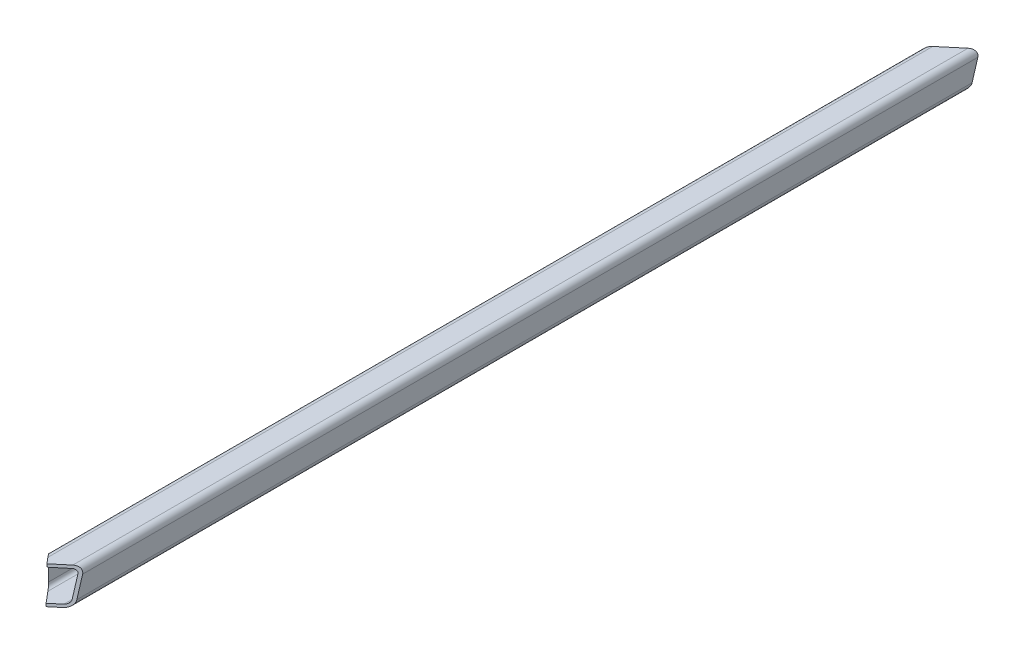
ISO-10303-21;
HEADER;
FILE_DESCRIPTION(('STEP AP214'),'2;1');
FILE_NAME('part.step','',(''),(''),'','','');
FILE_SCHEMA(('AUTOMOTIVE_DESIGN { 1 0 10303 214 1 1 1 1 }'));
ENDSEC;
DATA;
#1=APPLICATION_CONTEXT('core data for automotive mechanical design processes');
#2=APPLICATION_PROTOCOL_DEFINITION('international standard','automotive_design',2000,#1);
#3=PRODUCT_CONTEXT('',#1,'mechanical');
#4=PRODUCT('Part','Part','',(#3));
#5=PRODUCT_RELATED_PRODUCT_CATEGORY('part','',(#4));
#6=PRODUCT_DEFINITION_FORMATION('','',#4);
#7=PRODUCT_DEFINITION_CONTEXT('part definition',#1,'design');
#8=PRODUCT_DEFINITION('design','',#6,#7);
#9=PRODUCT_DEFINITION_SHAPE('','',#8);
#10=(LENGTH_UNIT() NAMED_UNIT(*) SI_UNIT(.MILLI.,.METRE.));
#11=(NAMED_UNIT(*) PLANE_ANGLE_UNIT() SI_UNIT($,.RADIAN.));
#12=(NAMED_UNIT(*) SI_UNIT($,.STERADIAN.) SOLID_ANGLE_UNIT());
#13=UNCERTAINTY_MEASURE_WITH_UNIT(LENGTH_MEASURE(1.E-05),#10,'distance_accuracy_value','');
#14=(GEOMETRIC_REPRESENTATION_CONTEXT(3) GLOBAL_UNCERTAINTY_ASSIGNED_CONTEXT((#13)) GLOBAL_UNIT_ASSIGNED_CONTEXT((#10,
#11,#12)) REPRESENTATION_CONTEXT('',''));
#15=CARTESIAN_POINT('',(0.,0.,0.));
#16=DIRECTION('',(0.,0.,1.));
#17=DIRECTION('',(1.,0.,0.));
#18=AXIS2_PLACEMENT_3D('',#15,#16,#17);
#19=CARTESIAN_POINT('',(-50.,-30.,0.));
#20=DIRECTION('',(-1.,0.,0.));
#21=DIRECTION('',(0.,1.,0.));
#22=AXIS2_PLACEMENT_3D('',#19,#20,#21);
#23=PLANE('',#22);
#24=DIRECTION('',(0.,-0.957462646749428,0.288557238827203));
#25=VECTOR('',#24,1.);
#26=CARTESIAN_POINT('',(-50.,7.09412884569476,73.3105957355298));
#27=LINE('',#26,#25);
#28=CARTESIAN_POINT('',(-50.,30.,66.4072925563847));
#29=VERTEX_POINT('',#28);
#30=CARTESIAN_POINT('',(-50.,-30.,84.4899137306008));
#31=VERTEX_POINT('',#30);
#32=EDGE_CURVE('E220',#29,#31,#27,.T.);
#33=ORIENTED_EDGE('',*,*,#32,.T.);
#34=DIRECTION('',(0.,0.,-1.));
#35=VECTOR('',#34,1.);
#36=CARTESIAN_POINT('',(-50.,-30.,0.));
#37=LINE('',#36,#35);
#38=CARTESIAN_POINT('',(-50.,-30.,2787.37015506374));
#39=VERTEX_POINT('',#38);
#40=EDGE_CURVE('E11',#39,#31,#37,.T.);
#41=ORIENTED_EDGE('',*,*,#40,.F.);
#42=DIRECTION('',(0.,1.,0.));
#43=VECTOR('',#42,1.);
#44=CARTESIAN_POINT('',(-50.,-14.9999999999995,2787.37015506374));
#45=LINE('',#44,#43);
#46=CARTESIAN_POINT('',(-50.,30.,2787.37015506374));
#47=VERTEX_POINT('',#46);
#48=EDGE_CURVE('E194',#39,#47,#45,.T.);
#49=ORIENTED_EDGE('',*,*,#48,.T.);
#50=DIRECTION('',(0.,0.,-1.));
#51=VECTOR('',#50,1.);
#52=CARTESIAN_POINT('',(-50.,30.,0.));
#53=LINE('',#52,#51);
#54=EDGE_CURVE('E103',#47,#29,#53,.T.);
#55=ORIENTED_EDGE('',*,*,#54,.T.);
#56=EDGE_LOOP('',(#33,#41,#49,#55));
#57=FACE_BOUND('',#56,.T.);
#58=ADVANCED_FACE('F17',(#57),#23,.T.);
#59=CARTESIAN_POINT('',(-30.,-30.,0.));
#60=DIRECTION('',(0.,0.,1.));
#61=DIRECTION('',(1.,0.,0.));
#62=AXIS2_PLACEMENT_3D('',#59,#60,#61);
#63=CYLINDRICAL_SURFACE('',#62,20.);
#64=CARTESIAN_POINT('',(-30.,-30.,67.7079211070552));
#65=DIRECTION('',(0.62631300489342,0.224951054343865,0.746410773670208));
#66=DIRECTION('',(0.702474766541767,0.252305856894065,-0.665485504687398));
#67=AXIS2_PLACEMENT_3D('',#64,#65,#66);
#68=ELLIPSE('',#67,26.7948972677031,20.);
#69=CARTESIAN_POINT('',(-30.,-50.,73.7354614984606));
#70=VERTEX_POINT('',#69);
#71=EDGE_CURVE('E264',#31,#70,#68,.T.);
#72=ORIENTED_EDGE('',*,*,#71,.T.);
#73=DIRECTION('',(0.,0.,1.));
#74=VECTOR('',#73,1.);
#75=CARTESIAN_POINT('',(-30.,-50.,0.));
#76=LINE('',#75,#74);
#77=CARTESIAN_POINT('',(-30.,-50.,2811.20522691563));
#78=VERTEX_POINT('',#77);
#79=EDGE_CURVE('E28',#70,#78,#76,.T.);
#80=ORIENTED_EDGE('',*,*,#79,.T.);
#81=CARTESIAN_POINT('',(-30.,-30.,2811.20522691563));
#82=DIRECTION('',(0.766044443118977,0.,-0.64278760968654));
#83=DIRECTION('',(0.64278760968654,0.,0.766044443118977));
#84=AXIS2_PLACEMENT_3D('',#81,#82,#83);
#85=ELLIPSE('',#84,31.1144765372082,20.);
#86=EDGE_CURVE('E190',#78,#39,#85,.T.);
#87=ORIENTED_EDGE('',*,*,#86,.T.);
#88=ORIENTED_EDGE('',*,*,#40,.T.);
#89=EDGE_LOOP('',(#72,#80,#87,#88));
#90=FACE_BOUND('',#89,.T.);
#91=ADVANCED_FACE('F561',(#90),#63,.T.);
#92=CARTESIAN_POINT('',(30.,-50.,0.));
#93=DIRECTION('',(0.,-1.,0.));
#94=DIRECTION('',(0.,0.,-1.));
#95=AXIS2_PLACEMENT_3D('',#92,#93,#94);
#96=PLANE('',#95);
#97=DIRECTION('',(0.766044443118978,0.,-0.642787609686539));
#98=VECTOR('',#97,1.);
#99=CARTESIAN_POINT('',(32.7147110753145,-50.,21.1115705657745));
#100=LINE('',#99,#98);
#101=CARTESIAN_POINT('',(30.,-50.,23.3894836278238));
#102=VERTEX_POINT('',#101);
#103=EDGE_CURVE('E311',#70,#102,#100,.T.);
#104=ORIENTED_EDGE('',*,*,#103,.T.);
#105=DIRECTION('',(0.,0.,-1.));
#106=VECTOR('',#105,1.);
#107=CARTESIAN_POINT('',(30.,-50.,0.));
#108=LINE('',#107,#106);
#109=CARTESIAN_POINT('',(30.,-50.,2823.4562481028));
#110=VERTEX_POINT('',#109);
#111=EDGE_CURVE('E205',#110,#102,#108,.T.);
#112=ORIENTED_EDGE('',*,*,#111,.F.);
#113=DIRECTION('',(-0.766044443118978,0.,0.642787609686539));
#114=VECTOR('',#113,1.);
#115=CARTESIAN_POINT('',(1411.47844037869,-50.,1664.25819830167));
#116=LINE('',#115,#114);
#117=CARTESIAN_POINT('',(0.823004993712573,-50.,2847.93865385143));
#118=VERTEX_POINT('',#117);
#119=EDGE_CURVE('E230',#110,#118,#116,.T.);
#120=ORIENTED_EDGE('',*,*,#119,.T.);
#121=DIRECTION('',(-0.64278760968654,0.,-0.766044443118977));
#122=VECTOR('',#121,1.);
#123=CARTESIAN_POINT('',(-1395.65543538498,-50.,1183.68045554977));
#124=LINE('',#123,#122);
#125=EDGE_CURVE('E193',#118,#78,#124,.T.);
#126=ORIENTED_EDGE('',*,*,#125,.T.);
#127=ORIENTED_EDGE('',*,*,#79,.F.);
#128=EDGE_LOOP('',(#104,#112,#120,#126,#127));
#129=FACE_BOUND('',#128,.T.);
#130=ADVANCED_FACE('F434',(#129),#96,.T.);
#131=CARTESIAN_POINT('',(-30.,30.,0.));
#132=DIRECTION('',(0.,0.,1.));
#133=DIRECTION('',(0.,-1.,0.));
#134=AXIS2_PLACEMENT_3D('',#131,#132,#133);
#135=CYLINDRICAL_SURFACE('',#134,20.);
#136=CARTESIAN_POINT('',(-30.,30.,49.6252999328391));
#137=DIRECTION('',(0.62631300489342,0.224951054343865,0.746410773670208));
#138=DIRECTION('',(-0.702474766541767,-0.252305856894065,0.665485504687398));
#139=AXIS2_PLACEMENT_3D('',#136,#137,#138);
#140=ELLIPSE('',#139,26.7948972677031,20.);
#141=CARTESIAN_POINT('',(-30.,50.,43.5977595414338));
#142=VERTEX_POINT('',#141);
#143=EDGE_CURVE('E21',#142,#29,#140,.T.);
#144=ORIENTED_EDGE('',*,*,#143,.T.);
#145=ORIENTED_EDGE('',*,*,#54,.F.);
#146=CARTESIAN_POINT('',(-30.,30.,2811.20522691563));
#147=DIRECTION('',(0.766044443118977,0.,-0.64278760968654));
#148=DIRECTION('',(0.64278760968654,0.,0.766044443118977));
#149=AXIS2_PLACEMENT_3D('',#146,#147,#148);
#150=ELLIPSE('',#149,31.1144765372082,20.);
#151=CARTESIAN_POINT('',(-30.,50.,2811.20522691563));
#152=VERTEX_POINT('',#151);
#153=EDGE_CURVE('E273',#47,#152,#150,.T.);
#154=ORIENTED_EDGE('',*,*,#153,.T.);
#155=DIRECTION('',(0.,0.,-1.));
#156=VECTOR('',#155,1.);
#157=CARTESIAN_POINT('',(-30.,50.,0.));
#158=LINE('',#157,#156);
#159=EDGE_CURVE('E195',#152,#142,#158,.T.);
#160=ORIENTED_EDGE('',*,*,#159,.T.);
#161=EDGE_LOOP('',(#144,#145,#154,#160));
#162=FACE_BOUND('',#161,.T.);
#163=ADVANCED_FACE('F500',(#162),#135,.T.);
#164=CARTESIAN_POINT('',(-30.,-30.,0.));
#165=DIRECTION('',(0.,0.,1.));
#166=DIRECTION('',(1.,0.,0.));
#167=AXIS2_PLACEMENT_3D('',#164,#165,#166);
#168=CYLINDRICAL_SURFACE('',#167,12.);
#169=CARTESIAN_POINT('',(-30.,-30.,67.7079211070552));
#170=DIRECTION('',(-0.62631300489342,-0.224951054343865,-0.746410773670208));
#171=DIRECTION('',(0.702474766541767,0.252305856894065,-0.665485504687398));
#172=AXIS2_PLACEMENT_3D('',#169,#170,#171);
#173=ELLIPSE('',#172,16.0769383606218,12.);
#174=CARTESIAN_POINT('',(-30.,-42.,71.3244453418984));
#175=VERTEX_POINT('',#174);
#176=CARTESIAN_POINT('',(-42.,-30.,77.7771166811826));
#177=VERTEX_POINT('',#176);
#178=EDGE_CURVE('E184',#175,#177,#173,.T.);
#179=ORIENTED_EDGE('',*,*,#178,.T.);
#180=DIRECTION('',(0.,0.,-1.));
#181=VECTOR('',#180,1.);
#182=CARTESIAN_POINT('',(-42.,-30.,0.));
#183=LINE('',#182,#181);
#184=CARTESIAN_POINT('',(-42.,-30.,2796.9041838045));
#185=VERTEX_POINT('',#184);
#186=EDGE_CURVE('E211',#185,#177,#183,.T.);
#187=ORIENTED_EDGE('',*,*,#186,.F.);
#188=CARTESIAN_POINT('',(-30.,-30.,2811.20522691563));
#189=DIRECTION('',(-0.766044443118977,0.,0.64278760968654));
#190=DIRECTION('',(0.64278760968654,0.,0.766044443118977));
#191=AXIS2_PLACEMENT_3D('',#188,#189,#190);
#192=ELLIPSE('',#191,18.6686859223249,12.);
#193=CARTESIAN_POINT('',(-30.,-42.,2811.20522691563));
#194=VERTEX_POINT('',#193);
#195=EDGE_CURVE('E265',#185,#194,#192,.T.);
#196=ORIENTED_EDGE('',*,*,#195,.T.);
#197=DIRECTION('',(0.,0.,-1.));
#198=VECTOR('',#197,1.);
#199=CARTESIAN_POINT('',(-30.,-42.,0.));
#200=LINE('',#199,#198);
#201=EDGE_CURVE('E280',#194,#175,#200,.T.);
#202=ORIENTED_EDGE('',*,*,#201,.T.);
#203=EDGE_LOOP('',(#179,#187,#196,#202));
#204=FACE_BOUND('',#203,.T.);
#205=ADVANCED_FACE('F359',(#204),#168,.F.);
#206=CARTESIAN_POINT('',(-42.,-30.,0.));
#207=DIRECTION('',(-1.,0.,0.));
#208=DIRECTION('',(0.,1.,0.));
#209=AXIS2_PLACEMENT_3D('',#206,#207,#208);
#210=PLANE('',#209);
#211=DIRECTION('',(0.,0.957462646749428,-0.288557238827203));
#212=VECTOR('',#211,1.);
#213=CARTESIAN_POINT('',(-42.,5.23949863124053,67.1567416125488));
#214=LINE('',#213,#212);
#215=CARTESIAN_POINT('',(-42.,30.,59.6944955069665));
#216=VERTEX_POINT('',#215);
#217=EDGE_CURVE('E209',#177,#216,#214,.T.);
#218=ORIENTED_EDGE('',*,*,#217,.T.);
#219=DIRECTION('',(0.,0.,1.));
#220=VECTOR('',#219,1.);
#221=CARTESIAN_POINT('',(-42.,30.,0.));
#222=LINE('',#221,#220);
#223=CARTESIAN_POINT('',(-42.,30.,2796.9041838045));
#224=VERTEX_POINT('',#223);
#225=EDGE_CURVE('E116',#216,#224,#222,.T.);
#226=ORIENTED_EDGE('',*,*,#225,.T.);
#227=DIRECTION('',(0.,-1.,0.));
#228=VECTOR('',#227,1.);
#229=CARTESIAN_POINT('',(-42.,-14.9999999999995,2796.9041838045));
#230=LINE('',#229,#228);
#231=EDGE_CURVE('E269',#224,#185,#230,.T.);
#232=ORIENTED_EDGE('',*,*,#231,.T.);
#233=ORIENTED_EDGE('',*,*,#186,.T.);
#234=EDGE_LOOP('',(#218,#226,#232,#233));
#235=FACE_BOUND('',#234,.T.);
#236=ADVANCED_FACE('F499',(#235),#210,.F.);
#237=CARTESIAN_POINT('',(-30.,30.,0.));
#238=DIRECTION('',(0.,0.,1.));
#239=DIRECTION('',(0.,-1.,0.));
#240=AXIS2_PLACEMENT_3D('',#237,#238,#239);
#241=CYLINDRICAL_SURFACE('',#240,12.);
#242=CARTESIAN_POINT('',(-30.,30.,49.6252999328391));
#243=DIRECTION('',(-0.62631300489342,-0.224951054343865,-0.746410773670208));
#244=DIRECTION('',(-0.702474766541767,-0.252305856894065,0.665485504687398));
#245=AXIS2_PLACEMENT_3D('',#242,#243,#244);
#246=ELLIPSE('',#245,16.0769383606218,12.);
#247=CARTESIAN_POINT('',(-30.,42.,46.0087756979959));
#248=VERTEX_POINT('',#247);
#249=EDGE_CURVE('E250',#216,#248,#246,.T.);
#250=ORIENTED_EDGE('',*,*,#249,.T.);
#251=DIRECTION('',(0.,0.,-1.));
#252=VECTOR('',#251,1.);
#253=CARTESIAN_POINT('',(-30.,42.,0.));
#254=LINE('',#253,#252);
#255=CARTESIAN_POINT('',(-30.,42.,2811.20522691563));
#256=VERTEX_POINT('',#255);
#257=EDGE_CURVE('E173',#256,#248,#254,.T.);
#258=ORIENTED_EDGE('',*,*,#257,.F.);
#259=CARTESIAN_POINT('',(-30.,30.,2811.20522691563));
#260=DIRECTION('',(-0.766044443118977,0.,0.64278760968654));
#261=DIRECTION('',(0.64278760968654,0.,0.766044443118977));
#262=AXIS2_PLACEMENT_3D('',#259,#260,#261);
#263=ELLIPSE('',#262,18.6686859223249,12.);
#264=EDGE_CURVE('E168',#256,#224,#263,.T.);
#265=ORIENTED_EDGE('',*,*,#264,.T.);
#266=ORIENTED_EDGE('',*,*,#225,.F.);
#267=EDGE_LOOP('',(#250,#258,#265,#266));
#268=FACE_BOUND('',#267,.T.);
#269=ADVANCED_FACE('F522',(#268),#241,.F.);
#270=CARTESIAN_POINT('',(-1401.85307405248,0.,1176.29439740218));
#271=DIRECTION('',(0.766044443118977,0.,-0.64278760968654));
#272=DIRECTION('',(0.,-1.,0.));
#273=AXIS2_PLACEMENT_3D('',#270,#271,#272);
#274=PLANE('',#273);
#275=DIRECTION('',(-0.14459575051816,0.974370064785235,-0.172322505153873));
#276=VECTOR('',#275,1.);
#277=CARTESIAN_POINT('',(-77.2010687028977,475.771479937275,2754.95318371466));
#278=LINE('',#277,#276);
#279=CARTESIAN_POINT('',(-0.364188708097686,-42.,2846.5238114922));
#280=VERTEX_POINT('',#279);
#281=EDGE_CURVE('E227',#118,#280,#278,.T.);
#282=ORIENTED_EDGE('',*,*,#281,.T.);
#283=DIRECTION('',(0.64278760968654,0.,0.766044443118977));
#284=VECTOR('',#283,1.);
#285=CARTESIAN_POINT('',(-1395.65543538498,-42.,1183.68045554977));
#286=LINE('',#285,#284);
#287=EDGE_CURVE('E270',#194,#280,#286,.T.);
#288=ORIENTED_EDGE('',*,*,#287,.F.);
#289=ORIENTED_EDGE('',*,*,#195,.F.);
#290=ORIENTED_EDGE('',*,*,#231,.F.);
#291=ORIENTED_EDGE('',*,*,#264,.F.);
#292=DIRECTION('',(-0.64278760968654,0.,-0.766044443118977));
#293=VECTOR('',#292,1.);
#294=CARTESIAN_POINT('',(-1408.05071271998,42.,1168.90833925458));
#295=LINE('',#294,#293);
#296=CARTESIAN_POINT('',(-12.829722577103,42.,2831.6679667202));
#297=VERTEX_POINT('',#296);
#298=EDGE_CURVE('E164',#297,#256,#295,.T.);
#299=ORIENTED_EDGE('',*,*,#298,.F.);
#300=DIRECTION('',(-0.14459575051816,0.974370064785235,-0.172322505153873));
#301=VECTOR('',#300,1.);
#302=CARTESIAN_POINT('',(-77.2010687028977,475.771479937275,2754.95318371466));
#303=LINE('',#302,#301);
#304=CARTESIAN_POINT('',(-14.016916278913,50.,2830.25312436097));
#305=VERTEX_POINT('',#304);
#306=EDGE_CURVE('E147',#297,#305,#303,.T.);
#307=ORIENTED_EDGE('',*,*,#306,.T.);
#308=DIRECTION('',(0.64278760968654,0.,0.766044443118977));
#309=VECTOR('',#308,1.);
#310=CARTESIAN_POINT('',(-1408.05071271998,50.,1168.90833925458));
#311=LINE('',#310,#309);
#312=EDGE_CURVE('E199',#152,#305,#311,.T.);
#313=ORIENTED_EDGE('',*,*,#312,.F.);
#314=ORIENTED_EDGE('',*,*,#153,.F.);
#315=ORIENTED_EDGE('',*,*,#48,.F.);
#316=ORIENTED_EDGE('',*,*,#86,.F.);
#317=ORIENTED_EDGE('',*,*,#125,.F.);
#318=EDGE_LOOP('',(#282,#288,#289,#290,#291,#299,#307,#313,#314,#315,#316,#317));
#319=FACE_BOUND('',#318,.T.);
#320=ADVANCED_FACE('F166',(#319),#274,.F.);
#321=CARTESIAN_POINT('',(30.,-42.,0.));
#322=DIRECTION('',(0.,-1.,0.));
#323=DIRECTION('',(0.,0.,-1.));
#324=AXIS2_PLACEMENT_3D('',#321,#322,#323);
#325=PLANE('',#324);
#326=DIRECTION('',(-0.766044443118978,0.,0.642787609686539));
#327=VECTOR('',#326,1.);
#328=CARTESIAN_POINT('',(31.5275173735045,-42.,19.6967282065372));
#329=LINE('',#328,#327);
#330=CARTESIAN_POINT('',(30.,-42.,20.9784674712617));
#331=VERTEX_POINT('',#330);
#332=EDGE_CURVE('E215',#331,#175,#329,.T.);
#333=ORIENTED_EDGE('',*,*,#332,.T.);
#334=ORIENTED_EDGE('',*,*,#201,.F.);
#335=ORIENTED_EDGE('',*,*,#287,.T.);
#336=DIRECTION('',(0.766044443118978,0.,-0.642787609686539));
#337=VECTOR('',#336,1.);
#338=CARTESIAN_POINT('',(1410.29124667688,-42.,1662.84335594243));
#339=LINE('',#338,#337);
#340=CARTESIAN_POINT('',(30.,-42.,2821.04523194623));
#341=VERTEX_POINT('',#340);
#342=EDGE_CURVE('E161',#280,#341,#339,.T.);
#343=ORIENTED_EDGE('',*,*,#342,.T.);
#344=DIRECTION('',(0.,0.,-1.));
#345=VECTOR('',#344,1.);
#346=CARTESIAN_POINT('',(30.,-42.,0.));
#347=LINE('',#346,#345);
#348=EDGE_CURVE('E247',#341,#331,#347,.T.);
#349=ORIENTED_EDGE('',*,*,#348,.T.);
#350=EDGE_LOOP('',(#333,#334,#335,#343,#349));
#351=FACE_BOUND('',#350,.T.);
#352=ADVANCED_FACE('F340',(#351),#325,.F.);
#353=CARTESIAN_POINT('',(1324.65200534958,475.771479937275,1578.65878631249));
#354=DIRECTION('',(-0.62631300489342,-0.224951054343865,-0.746410773670208));
#355=DIRECTION('',(-0.766044443118978,0.,0.64278760968654));
#356=AXIS2_PLACEMENT_3D('',#353,#354,#355);
#357=PLANE('',#356);
#358=ORIENTED_EDGE('',*,*,#306,.F.);
#359=DIRECTION('',(-0.766044443118978,0.,0.642787609686539));
#360=VECTOR('',#359,1.);
#361=CARTESIAN_POINT('',(1380.22099014288,42.,1662.75962746562));
#362=LINE('',#361,#360);
#363=CARTESIAN_POINT('',(30.,42.,2795.72956230233));
#364=VERTEX_POINT('',#363);
#365=EDGE_CURVE('E152',#364,#297,#362,.T.);
#366=ORIENTED_EDGE('',*,*,#365,.F.);
#367=CARTESIAN_POINT('',(30.,30.,2799.34608653717));
#368=DIRECTION('',(0.62631300489342,0.224951054343865,0.746410773670208));
#369=DIRECTION('',(-0.702474766541767,-0.252305856894065,0.665485504687398));
#370=AXIS2_PLACEMENT_3D('',#367,#368,#369);
#371=ELLIPSE('',#370,16.0769383606219,12.);
#372=CARTESIAN_POINT('',(42.,30.,2789.27689096305));
#373=VERTEX_POINT('',#372);
#374=EDGE_CURVE('E290',#373,#364,#371,.T.);
#375=ORIENTED_EDGE('',*,*,#374,.F.);
#376=DIRECTION('',(0.,0.957462646749428,-0.288557238827203));
#377=VECTOR('',#376,1.);
#378=CARTESIAN_POINT('',(42.,786.878146205039,2561.1712110819));
#379=LINE('',#378,#377);
#380=CARTESIAN_POINT('',(42.,-30.,2807.35951213726));
#381=VERTEX_POINT('',#380);
#382=EDGE_CURVE('E304',#381,#373,#379,.T.);
#383=ORIENTED_EDGE('',*,*,#382,.F.);
#384=CARTESIAN_POINT('',(30.,-30.,2817.42870771139));
#385=DIRECTION('',(0.62631300489342,0.224951054343865,0.746410773670208));
#386=DIRECTION('',(0.702474766541767,0.252305856894065,-0.665485504687399));
#387=AXIS2_PLACEMENT_3D('',#384,#385,#386);
#388=ELLIPSE('',#387,16.0769383606219,12.);
#389=EDGE_CURVE('E243',#341,#381,#388,.T.);
#390=ORIENTED_EDGE('',*,*,#389,.F.);
#391=ORIENTED_EDGE('',*,*,#342,.F.);
#392=ORIENTED_EDGE('',*,*,#281,.F.);
#393=ORIENTED_EDGE('',*,*,#119,.F.);
#394=CARTESIAN_POINT('',(30.,-30.,2817.42870771139));
#395=DIRECTION('',(-0.62631300489342,-0.224951054343865,-0.746410773670208));
#396=DIRECTION('',(0.702474766541767,0.252305856894065,-0.665485504687399));
#397=AXIS2_PLACEMENT_3D('',#394,#395,#396);
#398=ELLIPSE('',#397,26.7948972677031,20.);
#399=CARTESIAN_POINT('',(50.,-30.,2800.64671508784));
#400=VERTEX_POINT('',#399);
#401=EDGE_CURVE('E231',#400,#110,#398,.T.);
#402=ORIENTED_EDGE('',*,*,#401,.F.);
#403=DIRECTION('',(0.,-0.957462646749428,0.288557238827203));
#404=VECTOR('',#403,1.);
#405=CARTESIAN_POINT('',(50.,785.023515990584,2555.01735695892));
#406=LINE('',#405,#404);
#407=CARTESIAN_POINT('',(50.,30.,2782.56409391363));
#408=VERTEX_POINT('',#407);
#409=EDGE_CURVE('E204',#408,#400,#406,.T.);
#410=ORIENTED_EDGE('',*,*,#409,.F.);
#411=CARTESIAN_POINT('',(30.,30.,2799.34608653717));
#412=DIRECTION('',(-0.62631300489342,-0.224951054343865,-0.746410773670208));
#413=DIRECTION('',(-0.702474766541767,-0.252305856894065,0.665485504687399));
#414=AXIS2_PLACEMENT_3D('',#411,#412,#413);
#415=ELLIPSE('',#414,26.7948972677031,20.);
#416=CARTESIAN_POINT('',(30.,50.,2793.31854614577));
#417=VERTEX_POINT('',#416);
#418=EDGE_CURVE('E200',#417,#408,#415,.T.);
#419=ORIENTED_EDGE('',*,*,#418,.F.);
#420=DIRECTION('',(0.766044443118978,0.,-0.642787609686539));
#421=VECTOR('',#420,1.);
#422=CARTESIAN_POINT('',(1379.03379644107,50.,1661.34478510638));
#423=LINE('',#422,#421);
#424=EDGE_CURVE('E156',#305,#417,#423,.T.);
#425=ORIENTED_EDGE('',*,*,#424,.F.);
#426=EDGE_LOOP('',(#358,#366,#375,#383,#390,#391,#392,#393,#402,#410,#419,#425));
#427=FACE_BOUND('',#426,.T.);
#428=ADVANCED_FACE('F149',(#427),#357,.F.);
#429=CARTESIAN_POINT('',(-30.,50.,0.));
#430=DIRECTION('',(0.,1.,0.));
#431=DIRECTION('',(1.,0.,0.));
#432=AXIS2_PLACEMENT_3D('',#429,#430,#431);
#433=PLANE('',#432);
#434=DIRECTION('',(-0.766044443118978,0.,0.642787609686539));
#435=VECTOR('',#434,1.);
#436=CARTESIAN_POINT('',(0.270067137684953,50.,18.1981573704908));
#437=LINE('',#436,#435);
#438=CARTESIAN_POINT('',(30.,50.,-6.74821832920299));
#439=VERTEX_POINT('',#438);
#440=EDGE_CURVE('E251',#439,#142,#437,.T.);
#441=ORIENTED_EDGE('',*,*,#440,.T.);
#442=ORIENTED_EDGE('',*,*,#159,.F.);
#443=ORIENTED_EDGE('',*,*,#312,.T.);
#444=ORIENTED_EDGE('',*,*,#424,.T.);
#445=DIRECTION('',(0.,0.,-1.));
#446=VECTOR('',#445,1.);
#447=CARTESIAN_POINT('',(30.,50.,0.));
#448=LINE('',#447,#446);
#449=EDGE_CURVE('E236',#417,#439,#448,.T.);
#450=ORIENTED_EDGE('',*,*,#449,.T.);
#451=EDGE_LOOP('',(#441,#442,#443,#444,#450));
#452=FACE_BOUND('',#451,.T.);
#453=ADVANCED_FACE('F402',(#452),#433,.T.);
#454=CARTESIAN_POINT('',(30.,30.,0.));
#455=DIRECTION('',(0.,0.,1.));
#456=DIRECTION('',(-1.,0.,0.));
#457=AXIS2_PLACEMENT_3D('',#454,#455,#456);
#458=CYLINDRICAL_SURFACE('',#457,20.);
#459=CARTESIAN_POINT('',(30.,30.,-0.720677937797634));
#460=DIRECTION('',(0.62631300489342,0.224951054343865,0.746410773670208));
#461=DIRECTION('',(-0.702474766541767,-0.252305856894065,0.665485504687398));
#462=AXIS2_PLACEMENT_3D('',#459,#460,#461);
#463=ELLIPSE('',#462,26.7948972677031,20.);
#464=CARTESIAN_POINT('',(50.,30.,-17.5026705613432));
#465=VERTEX_POINT('',#464);
#466=EDGE_CURVE('E255',#465,#439,#463,.T.);
#467=ORIENTED_EDGE('',*,*,#466,.T.);
#468=ORIENTED_EDGE('',*,*,#449,.F.);
#469=ORIENTED_EDGE('',*,*,#418,.T.);
#470=DIRECTION('',(0.,0.,-1.));
#471=VECTOR('',#470,1.);
#472=CARTESIAN_POINT('',(50.,30.,0.));
#473=LINE('',#472,#471);
#474=EDGE_CURVE('E201',#408,#465,#473,.T.);
#475=ORIENTED_EDGE('',*,*,#474,.T.);
#476=EDGE_LOOP('',(#467,#468,#469,#475));
#477=FACE_BOUND('',#476,.T.);
#478=ADVANCED_FACE('F409',(#477),#458,.T.);
#479=CARTESIAN_POINT('',(50.,30.,0.));
#480=DIRECTION('',(1.,0.,0.));
#481=DIRECTION('',(0.,1.,0.));
#482=AXIS2_PLACEMENT_3D('',#479,#480,#481);
#483=PLANE('',#482);
#484=DIRECTION('',(0.,0.957462646749428,-0.288557238827203));
#485=VECTOR('',#484,1.);
#486=CARTESIAN_POINT('',(50.,11.4132927626295,-11.9010641305194));
#487=LINE('',#486,#485);
#488=CARTESIAN_POINT('',(50.,-30.,0.579950612872858));
#489=VERTEX_POINT('',#488);
#490=EDGE_CURVE('E256',#489,#465,#487,.T.);
#491=ORIENTED_EDGE('',*,*,#490,.T.);
#492=ORIENTED_EDGE('',*,*,#474,.F.);
#493=ORIENTED_EDGE('',*,*,#409,.T.);
#494=DIRECTION('',(0.,0.,-1.));
#495=VECTOR('',#494,1.);
#496=CARTESIAN_POINT('',(50.,-30.,0.));
#497=LINE('',#496,#495);
#498=EDGE_CURVE('E235',#400,#489,#497,.T.);
#499=ORIENTED_EDGE('',*,*,#498,.T.);
#500=EDGE_LOOP('',(#491,#492,#493,#499));
#501=FACE_BOUND('',#500,.T.);
#502=ADVANCED_FACE('F570',(#501),#483,.T.);
#503=CARTESIAN_POINT('',(30.,-30.,0.));
#504=DIRECTION('',(0.,0.,1.));
#505=DIRECTION('',(0.,1.,0.));
#506=AXIS2_PLACEMENT_3D('',#503,#504,#505);
#507=CYLINDRICAL_SURFACE('',#506,20.);
#508=CARTESIAN_POINT('',(30.,-30.,17.3619432364184));
#509=DIRECTION('',(0.62631300489342,0.224951054343865,0.746410773670208));
#510=DIRECTION('',(0.702474766541767,0.252305856894065,-0.665485504687398));
#511=AXIS2_PLACEMENT_3D('',#508,#509,#510);
#512=ELLIPSE('',#511,26.7948972677031,20.);
#513=EDGE_CURVE('E260',#102,#489,#512,.T.);
#514=ORIENTED_EDGE('',*,*,#513,.T.);
#515=ORIENTED_EDGE('',*,*,#498,.F.);
#516=ORIENTED_EDGE('',*,*,#401,.T.);
#517=ORIENTED_EDGE('',*,*,#111,.T.);
#518=EDGE_LOOP('',(#514,#515,#516,#517));
#519=FACE_BOUND('',#518,.T.);
#520=ADVANCED_FACE('F427',(#519),#507,.T.);
#521=CARTESIAN_POINT('',(30.,-30.,0.));
#522=DIRECTION('',(0.,0.,1.));
#523=DIRECTION('',(0.,1.,0.));
#524=AXIS2_PLACEMENT_3D('',#521,#522,#523);
#525=CYLINDRICAL_SURFACE('',#524,12.);
#526=CARTESIAN_POINT('',(30.,-30.,17.3619432364184));
#527=DIRECTION('',(-0.62631300489342,-0.224951054343865,-0.746410773670208));
#528=DIRECTION('',(0.702474766541767,0.252305856894065,-0.665485504687398));
#529=AXIS2_PLACEMENT_3D('',#526,#527,#528);
#530=ELLIPSE('',#529,16.0769383606218,12.);
#531=CARTESIAN_POINT('',(42.,-30.,7.29274766229109));
#532=VERTEX_POINT('',#531);
#533=EDGE_CURVE('E219',#532,#331,#530,.T.);
#534=ORIENTED_EDGE('',*,*,#533,.T.);
#535=ORIENTED_EDGE('',*,*,#348,.F.);
#536=ORIENTED_EDGE('',*,*,#389,.T.);
#537=DIRECTION('',(0.,0.,-1.));
#538=VECTOR('',#537,1.);
#539=CARTESIAN_POINT('',(42.,-30.,0.));
#540=LINE('',#539,#538);
#541=EDGE_CURVE('E188',#381,#532,#540,.T.);
#542=ORIENTED_EDGE('',*,*,#541,.T.);
#543=EDGE_LOOP('',(#534,#535,#536,#542));
#544=FACE_BOUND('',#543,.T.);
#545=ADVANCED_FACE('F349',(#544),#525,.F.);
#546=CARTESIAN_POINT('',(42.,30.,0.));
#547=DIRECTION('',(1.,0.,0.));
#548=DIRECTION('',(0.,1.,0.));
#549=AXIS2_PLACEMENT_3D('',#546,#547,#548);
#550=PLANE('',#549);
#551=DIRECTION('',(0.,-0.957462646749428,0.288557238827203));
#552=VECTOR('',#551,1.);
#553=CARTESIAN_POINT('',(42.,13.2679229770837,-5.74721000753832));
#554=LINE('',#553,#552);
#555=CARTESIAN_POINT('',(42.,30.,-10.789873511925));
#556=VERTEX_POINT('',#555);
#557=EDGE_CURVE('E226',#556,#532,#554,.T.);
#558=ORIENTED_EDGE('',*,*,#557,.T.);
#559=ORIENTED_EDGE('',*,*,#541,.F.);
#560=ORIENTED_EDGE('',*,*,#382,.T.);
#561=DIRECTION('',(0.,0.,-1.));
#562=VECTOR('',#561,1.);
#563=CARTESIAN_POINT('',(42.,30.,0.));
#564=LINE('',#563,#562);
#565=EDGE_CURVE('E286',#373,#556,#564,.T.);
#566=ORIENTED_EDGE('',*,*,#565,.T.);
#567=EDGE_LOOP('',(#558,#559,#560,#566));
#568=FACE_BOUND('',#567,.T.);
#569=ADVANCED_FACE('F506',(#568),#550,.F.);
#570=CARTESIAN_POINT('',(30.,30.,0.));
#571=DIRECTION('',(0.,0.,1.));
#572=DIRECTION('',(-1.,0.,0.));
#573=AXIS2_PLACEMENT_3D('',#570,#571,#572);
#574=CYLINDRICAL_SURFACE('',#573,12.);
#575=CARTESIAN_POINT('',(30.,30.,-0.720677937797634));
#576=DIRECTION('',(-0.62631300489342,-0.224951054343865,-0.746410773670208));
#577=DIRECTION('',(-0.702474766541767,-0.252305856894065,0.665485504687398));
#578=AXIS2_PLACEMENT_3D('',#575,#576,#577);
#579=ELLIPSE('',#578,16.0769383606218,12.);
#580=CARTESIAN_POINT('',(30.,42.,-4.33720217264086));
#581=VERTEX_POINT('',#580);
#582=EDGE_CURVE('E221',#581,#556,#579,.T.);
#583=ORIENTED_EDGE('',*,*,#582,.T.);
#584=ORIENTED_EDGE('',*,*,#565,.F.);
#585=ORIENTED_EDGE('',*,*,#374,.T.);
#586=DIRECTION('',(0.,0.,-1.));
#587=VECTOR('',#586,1.);
#588=CARTESIAN_POINT('',(30.,42.,0.));
#589=LINE('',#588,#587);
#590=EDGE_CURVE('E177',#364,#581,#589,.T.);
#591=ORIENTED_EDGE('',*,*,#590,.T.);
#592=EDGE_LOOP('',(#583,#584,#585,#591));
#593=FACE_BOUND('',#592,.T.);
#594=ADVANCED_FACE('F511',(#593),#574,.F.);
#595=CARTESIAN_POINT('',(-30.,42.,0.));
#596=DIRECTION('',(0.,1.,0.));
#597=DIRECTION('',(1.,0.,0.));
#598=AXIS2_PLACEMENT_3D('',#595,#596,#597);
#599=PLANE('',#598);
#600=DIRECTION('',(0.766044443118978,0.,-0.642787609686539));
#601=VECTOR('',#600,1.);
#602=CARTESIAN_POINT('',(1.457260839495,42.,19.6129997297282));
#603=LINE('',#602,#601);
#604=EDGE_CURVE('E225',#248,#581,#603,.T.);
#605=ORIENTED_EDGE('',*,*,#604,.T.);
#606=ORIENTED_EDGE('',*,*,#590,.F.);
#607=ORIENTED_EDGE('',*,*,#365,.T.);
#608=ORIENTED_EDGE('',*,*,#298,.T.);
#609=ORIENTED_EDGE('',*,*,#257,.T.);
#610=EDGE_LOOP('',(#605,#606,#607,#608,#609));
#611=FACE_BOUND('',#610,.T.);
#612=ADVANCED_FACE('F19',(#611),#599,.F.);
#613=CARTESIAN_POINT('',(15.6578251223355,5.62377635859662,18.6602693417552));
#614=DIRECTION('',(0.62631300489342,0.224951054343865,0.746410773670208));
#615=DIRECTION('',(0.338025475775813,-0.941136960132018,0.));
#616=AXIS2_PLACEMENT_3D('',#613,#614,#615);
#617=PLANE('',#616);
#618=ORIENTED_EDGE('',*,*,#332,.F.);
#619=ORIENTED_EDGE('',*,*,#533,.F.);
#620=ORIENTED_EDGE('',*,*,#557,.F.);
#621=ORIENTED_EDGE('',*,*,#582,.F.);
#622=ORIENTED_EDGE('',*,*,#604,.F.);
#623=ORIENTED_EDGE('',*,*,#249,.F.);
#624=ORIENTED_EDGE('',*,*,#217,.F.);
#625=ORIENTED_EDGE('',*,*,#178,.F.);
#626=EDGE_LOOP('',(#618,#619,#620,#621,#622,#623,#624,#625));
#627=FACE_BOUND('',#626,.T.);
#628=ORIENTED_EDGE('',*,*,#143,.F.);
#629=ORIENTED_EDGE('',*,*,#440,.F.);
#630=ORIENTED_EDGE('',*,*,#466,.F.);
#631=ORIENTED_EDGE('',*,*,#490,.F.);
#632=ORIENTED_EDGE('',*,*,#513,.F.);
#633=ORIENTED_EDGE('',*,*,#103,.F.);
#634=ORIENTED_EDGE('',*,*,#71,.F.);
#635=ORIENTED_EDGE('',*,*,#32,.F.);
#636=EDGE_LOOP('',(#628,#629,#630,#631,#632,#633,#634,#635));
#637=FACE_BOUND('',#636,.T.);
#638=ADVANCED_FACE('F354',(#627,#637),#617,.F.);
#639=CLOSED_SHELL('',(#58,#91,#130,#163,#205,#236,#269,#320,#352,#428,#453,#478,#502,#520,#545,
#569,#594,#612,#638));
#640=MANIFOLD_SOLID_BREP('B1',#639);
#641=ADVANCED_BREP_SHAPE_REPRESENTATION('',(#18,#640),#14);
#642=SHAPE_DEFINITION_REPRESENTATION(#9,#641);
ENDSEC;
END-ISO-10303-21;
